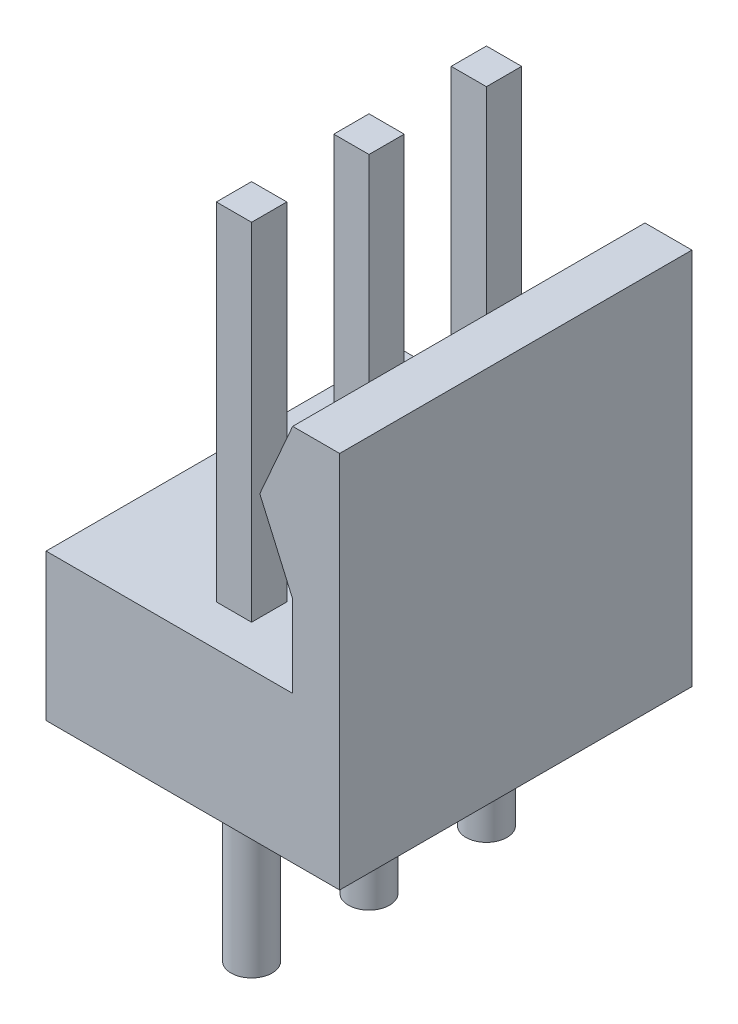
ISO-10303-21;
HEADER;
FILE_DESCRIPTION(('STEP AP214'),'2;1');
FILE_NAME('part.step','',(''),(''),'','','');
FILE_SCHEMA(('AUTOMOTIVE_DESIGN { 1 0 10303 214 1 1 1 1 }'));
ENDSEC;
DATA;
#1=APPLICATION_CONTEXT('core data for automotive mechanical design processes');
#2=APPLICATION_PROTOCOL_DEFINITION('international standard','automotive_design',2000,#1);
#3=PRODUCT_CONTEXT('',#1,'mechanical');
#4=PRODUCT('Part','Part','',(#3));
#5=PRODUCT_RELATED_PRODUCT_CATEGORY('part','',(#4));
#6=PRODUCT_DEFINITION_FORMATION('','',#4);
#7=PRODUCT_DEFINITION_CONTEXT('part definition',#1,'design');
#8=PRODUCT_DEFINITION('design','',#6,#7);
#9=PRODUCT_DEFINITION_SHAPE('','',#8);
#10=(LENGTH_UNIT() NAMED_UNIT(*) SI_UNIT(.MILLI.,.METRE.));
#11=(NAMED_UNIT(*) PLANE_ANGLE_UNIT() SI_UNIT($,.RADIAN.));
#12=(NAMED_UNIT(*) SI_UNIT($,.STERADIAN.) SOLID_ANGLE_UNIT());
#13=UNCERTAINTY_MEASURE_WITH_UNIT(LENGTH_MEASURE(1.E-05),#10,'distance_accuracy_value','');
#14=(GEOMETRIC_REPRESENTATION_CONTEXT(3) GLOBAL_UNCERTAINTY_ASSIGNED_CONTEXT((#13)) GLOBAL_UNIT_ASSIGNED_CONTEXT((#10,
#11,#12)) REPRESENTATION_CONTEXT('',''));
#15=CARTESIAN_POINT('',(0.,0.,0.));
#16=DIRECTION('',(0.,0.,1.));
#17=DIRECTION('',(1.,0.,0.));
#18=AXIS2_PLACEMENT_3D('',#15,#16,#17);
#19=CARTESIAN_POINT('',(-0.381,0.,2.159));
#20=DIRECTION('',(0.,0.,-1.));
#21=DIRECTION('',(-1.,0.,0.));
#22=AXIS2_PLACEMENT_3D('',#19,#20,#21);
#23=PLANE('',#22);
#24=DIRECTION('',(1.,0.,0.));
#25=VECTOR('',#24,1.);
#26=CARTESIAN_POINT('',(0.,10.668,2.159));
#27=LINE('',#26,#25);
#28=CARTESIAN_POINT('',(0.381,10.668,2.159));
#29=VERTEX_POINT('',#28);
#30=CARTESIAN_POINT('',(-0.381,10.668,2.159));
#31=VERTEX_POINT('',#30);
#32=EDGE_CURVE('E167',#29,#31,#27,.F.);
#33=ORIENTED_EDGE('',*,*,#32,.F.);
#34=DIRECTION('',(0.,1.,0.));
#35=VECTOR('',#34,1.);
#36=CARTESIAN_POINT('',(0.381,0.,2.159));
#37=LINE('',#36,#35);
#38=CARTESIAN_POINT('',(0.381,3.175,2.159));
#39=VERTEX_POINT('',#38);
#40=EDGE_CURVE('E150',#39,#29,#37,.T.);
#41=ORIENTED_EDGE('',*,*,#40,.F.);
#42=DIRECTION('',(-1.,0.,0.));
#43=VECTOR('',#42,1.);
#44=CARTESIAN_POINT('',(-0.381,3.175,2.159));
#45=LINE('',#44,#43);
#46=CARTESIAN_POINT('',(-0.381,3.175,2.159));
#47=VERTEX_POINT('',#46);
#48=EDGE_CURVE('E155',#39,#47,#45,.T.);
#49=ORIENTED_EDGE('',*,*,#48,.T.);
#50=DIRECTION('',(0.,1.,0.));
#51=VECTOR('',#50,1.);
#52=CARTESIAN_POINT('',(-0.381,0.,2.159));
#53=LINE('',#52,#51);
#54=EDGE_CURVE('E272',#31,#47,#53,.F.);
#55=ORIENTED_EDGE('',*,*,#54,.F.);
#56=EDGE_LOOP('',(#33,#41,#49,#55));
#57=FACE_BOUND('',#56,.T.);
#58=ADVANCED_FACE('F16',(#57),#23,.T.);
#59=CARTESIAN_POINT('',(-0.381,0.,4.699));
#60=DIRECTION('',(0.,0.,-1.));
#61=DIRECTION('',(-1.,0.,0.));
#62=AXIS2_PLACEMENT_3D('',#59,#60,#61);
#63=PLANE('',#62);
#64=DIRECTION('',(1.,0.,0.));
#65=VECTOR('',#64,1.);
#66=CARTESIAN_POINT('',(0.,10.668,4.699));
#67=LINE('',#66,#65);
#68=CARTESIAN_POINT('',(0.381,10.668,4.699));
#69=VERTEX_POINT('',#68);
#70=CARTESIAN_POINT('',(-0.381,10.668,4.699));
#71=VERTEX_POINT('',#70);
#72=EDGE_CURVE('E262',#69,#71,#67,.F.);
#73=ORIENTED_EDGE('',*,*,#72,.F.);
#74=DIRECTION('',(0.,1.,0.));
#75=VECTOR('',#74,1.);
#76=CARTESIAN_POINT('',(0.381,0.,4.699));
#77=LINE('',#76,#75);
#78=CARTESIAN_POINT('',(0.381,3.175,4.699));
#79=VERTEX_POINT('',#78);
#80=EDGE_CURVE('E267',#79,#69,#77,.T.);
#81=ORIENTED_EDGE('',*,*,#80,.F.);
#82=DIRECTION('',(-1.,0.,0.));
#83=VECTOR('',#82,1.);
#84=CARTESIAN_POINT('',(-0.381,3.175,4.699));
#85=LINE('',#84,#83);
#86=CARTESIAN_POINT('',(-0.381,3.175,4.699));
#87=VERTEX_POINT('',#86);
#88=EDGE_CURVE('E165',#79,#87,#85,.T.);
#89=ORIENTED_EDGE('',*,*,#88,.T.);
#90=DIRECTION('',(0.,1.,0.));
#91=VECTOR('',#90,1.);
#92=CARTESIAN_POINT('',(-0.381,0.,4.699));
#93=LINE('',#92,#91);
#94=EDGE_CURVE('E254',#71,#87,#93,.F.);
#95=ORIENTED_EDGE('',*,*,#94,.F.);
#96=EDGE_LOOP('',(#73,#81,#89,#95));
#97=FACE_BOUND('',#96,.T.);
#98=ADVANCED_FACE('F343',(#97),#63,.T.);
#99=CARTESIAN_POINT('',(-0.381,0.,-0.381));
#100=DIRECTION('',(0.,0.,-1.));
#101=DIRECTION('',(-1.,0.,0.));
#102=AXIS2_PLACEMENT_3D('',#99,#100,#101);
#103=PLANE('',#102);
#104=DIRECTION('',(1.,0.,0.));
#105=VECTOR('',#104,1.);
#106=CARTESIAN_POINT('',(0.,10.668,-0.381));
#107=LINE('',#106,#105);
#108=CARTESIAN_POINT('',(0.381,10.668,-0.381));
#109=VERTEX_POINT('',#108);
#110=CARTESIAN_POINT('',(-0.381,10.668,-0.381));
#111=VERTEX_POINT('',#110);
#112=EDGE_CURVE('E244',#109,#111,#107,.F.);
#113=ORIENTED_EDGE('',*,*,#112,.F.);
#114=DIRECTION('',(0.,1.,0.));
#115=VECTOR('',#114,1.);
#116=CARTESIAN_POINT('',(0.381,0.,-0.381));
#117=LINE('',#116,#115);
#118=CARTESIAN_POINT('',(0.381,3.175,-0.381));
#119=VERTEX_POINT('',#118);
#120=EDGE_CURVE('E249',#119,#109,#117,.T.);
#121=ORIENTED_EDGE('',*,*,#120,.F.);
#122=DIRECTION('',(-1.,0.,0.));
#123=VECTOR('',#122,1.);
#124=CARTESIAN_POINT('',(-0.381,3.175,-0.381));
#125=LINE('',#124,#123);
#126=CARTESIAN_POINT('',(-0.381,3.175,-0.381));
#127=VERTEX_POINT('',#126);
#128=EDGE_CURVE('E175',#119,#127,#125,.T.);
#129=ORIENTED_EDGE('',*,*,#128,.T.);
#130=DIRECTION('',(0.,1.,0.));
#131=VECTOR('',#130,1.);
#132=CARTESIAN_POINT('',(-0.381,0.,-0.381));
#133=LINE('',#132,#131);
#134=EDGE_CURVE('E236',#111,#127,#133,.F.);
#135=ORIENTED_EDGE('',*,*,#134,.F.);
#136=EDGE_LOOP('',(#113,#121,#129,#135));
#137=FACE_BOUND('',#136,.T.);
#138=ADVANCED_FACE('F341',(#137),#103,.T.);
#139=CARTESIAN_POINT('',(0.381,0.,2.159));
#140=DIRECTION('',(1.,0.,0.));
#141=DIRECTION('',(0.,0.,-1.));
#142=AXIS2_PLACEMENT_3D('',#139,#140,#141);
#143=PLANE('',#142);
#144=DIRECTION('',(0.,0.,1.));
#145=VECTOR('',#144,1.);
#146=CARTESIAN_POINT('',(0.381,10.668,2.54));
#147=LINE('',#146,#145);
#148=CARTESIAN_POINT('',(0.381,10.668,2.921));
#149=VERTEX_POINT('',#148);
#150=EDGE_CURVE('E169',#149,#29,#147,.F.);
#151=ORIENTED_EDGE('',*,*,#150,.F.);
#152=DIRECTION('',(0.,1.,0.));
#153=VECTOR('',#152,1.);
#154=CARTESIAN_POINT('',(0.381,0.,2.921));
#155=LINE('',#154,#153);
#156=CARTESIAN_POINT('',(0.381,3.175,2.921));
#157=VERTEX_POINT('',#156);
#158=EDGE_CURVE('E173',#157,#149,#155,.T.);
#159=ORIENTED_EDGE('',*,*,#158,.F.);
#160=DIRECTION('',(0.,0.,-1.));
#161=VECTOR('',#160,1.);
#162=CARTESIAN_POINT('',(0.381,3.175,2.159));
#163=LINE('',#162,#161);
#164=EDGE_CURVE('E159',#157,#39,#163,.T.);
#165=ORIENTED_EDGE('',*,*,#164,.T.);
#166=ORIENTED_EDGE('',*,*,#40,.T.);
#167=EDGE_LOOP('',(#151,#159,#165,#166));
#168=FACE_BOUND('',#167,.T.);
#169=ADVANCED_FACE('F171',(#168),#143,.T.);
#170=CARTESIAN_POINT('',(0.,10.668,2.54));
#171=DIRECTION('',(0.,1.,0.));
#172=DIRECTION('',(0.,0.,1.));
#173=AXIS2_PLACEMENT_3D('',#170,#171,#172);
#174=PLANE('',#173);
#175=ORIENTED_EDGE('',*,*,#150,.T.);
#176=ORIENTED_EDGE('',*,*,#32,.T.);
#177=DIRECTION('',(0.,0.,1.));
#178=VECTOR('',#177,1.);
#179=CARTESIAN_POINT('',(-0.381,10.668,2.921));
#180=LINE('',#179,#178);
#181=CARTESIAN_POINT('',(-0.381,10.668,2.921));
#182=VERTEX_POINT('',#181);
#183=EDGE_CURVE('E274',#182,#31,#180,.F.);
#184=ORIENTED_EDGE('',*,*,#183,.F.);
#185=DIRECTION('',(1.,0.,0.));
#186=VECTOR('',#185,1.);
#187=CARTESIAN_POINT('',(0.381,10.668,2.921));
#188=LINE('',#187,#186);
#189=EDGE_CURVE('E232',#149,#182,#188,.F.);
#190=ORIENTED_EDGE('',*,*,#189,.F.);
#191=EDGE_LOOP('',(#175,#176,#184,#190));
#192=FACE_BOUND('',#191,.T.);
#193=ADVANCED_FACE('F280',(#192),#174,.T.);
#194=CARTESIAN_POINT('',(-0.381,0.,2.921));
#195=DIRECTION('',(-1.,0.,0.));
#196=DIRECTION('',(0.,0.,1.));
#197=AXIS2_PLACEMENT_3D('',#194,#195,#196);
#198=PLANE('',#197);
#199=ORIENTED_EDGE('',*,*,#183,.T.);
#200=ORIENTED_EDGE('',*,*,#54,.T.);
#201=DIRECTION('',(0.,0.,1.));
#202=VECTOR('',#201,1.);
#203=CARTESIAN_POINT('',(-0.381,3.175,2.921));
#204=LINE('',#203,#202);
#205=CARTESIAN_POINT('',(-0.381,3.175,2.921));
#206=VERTEX_POINT('',#205);
#207=EDGE_CURVE('E161',#47,#206,#204,.T.);
#208=ORIENTED_EDGE('',*,*,#207,.T.);
#209=DIRECTION('',(0.,1.,0.));
#210=VECTOR('',#209,1.);
#211=CARTESIAN_POINT('',(-0.381,0.,2.921));
#212=LINE('',#211,#210);
#213=EDGE_CURVE('E229',#182,#206,#212,.F.);
#214=ORIENTED_EDGE('',*,*,#213,.F.);
#215=EDGE_LOOP('',(#199,#200,#208,#214));
#216=FACE_BOUND('',#215,.T.);
#217=ADVANCED_FACE('F436',(#216),#198,.T.);
#218=CARTESIAN_POINT('',(0.381,0.,4.699));
#219=DIRECTION('',(1.,0.,0.));
#220=DIRECTION('',(0.,0.,-1.));
#221=AXIS2_PLACEMENT_3D('',#218,#219,#220);
#222=PLANE('',#221);
#223=DIRECTION('',(0.,0.,1.));
#224=VECTOR('',#223,1.);
#225=CARTESIAN_POINT('',(0.381,10.668,5.08));
#226=LINE('',#225,#224);
#227=CARTESIAN_POINT('',(0.381,10.668,5.461));
#228=VERTEX_POINT('',#227);
#229=EDGE_CURVE('E264',#228,#69,#226,.F.);
#230=ORIENTED_EDGE('',*,*,#229,.F.);
#231=DIRECTION('',(0.,1.,0.));
#232=VECTOR('',#231,1.);
#233=CARTESIAN_POINT('',(0.381,0.,5.461));
#234=LINE('',#233,#232);
#235=CARTESIAN_POINT('',(0.381,3.175,5.461));
#236=VERTEX_POINT('',#235);
#237=EDGE_CURVE('E226',#236,#228,#234,.T.);
#238=ORIENTED_EDGE('',*,*,#237,.F.);
#239=DIRECTION('',(0.,0.,-1.));
#240=VECTOR('',#239,1.);
#241=CARTESIAN_POINT('',(0.381,3.175,4.699));
#242=LINE('',#241,#240);
#243=EDGE_CURVE('E269',#236,#79,#242,.T.);
#244=ORIENTED_EDGE('',*,*,#243,.T.);
#245=ORIENTED_EDGE('',*,*,#80,.T.);
#246=EDGE_LOOP('',(#230,#238,#244,#245));
#247=FACE_BOUND('',#246,.T.);
#248=ADVANCED_FACE('F432',(#247),#222,.T.);
#249=CARTESIAN_POINT('',(0.,10.668,5.08));
#250=DIRECTION('',(0.,1.,0.));
#251=DIRECTION('',(0.,0.,1.));
#252=AXIS2_PLACEMENT_3D('',#249,#250,#251);
#253=PLANE('',#252);
#254=ORIENTED_EDGE('',*,*,#229,.T.);
#255=ORIENTED_EDGE('',*,*,#72,.T.);
#256=DIRECTION('',(0.,0.,1.));
#257=VECTOR('',#256,1.);
#258=CARTESIAN_POINT('',(-0.381,10.668,5.461));
#259=LINE('',#258,#257);
#260=CARTESIAN_POINT('',(-0.381,10.668,5.461));
#261=VERTEX_POINT('',#260);
#262=EDGE_CURVE('E257',#261,#71,#259,.F.);
#263=ORIENTED_EDGE('',*,*,#262,.F.);
#264=DIRECTION('',(1.,0.,0.));
#265=VECTOR('',#264,1.);
#266=CARTESIAN_POINT('',(0.381,10.668,5.461));
#267=LINE('',#266,#265);
#268=EDGE_CURVE('E223',#228,#261,#267,.F.);
#269=ORIENTED_EDGE('',*,*,#268,.F.);
#270=EDGE_LOOP('',(#254,#255,#263,#269));
#271=FACE_BOUND('',#270,.T.);
#272=ADVANCED_FACE('F428',(#271),#253,.T.);
#273=CARTESIAN_POINT('',(-0.381,0.,5.461));
#274=DIRECTION('',(-1.,0.,0.));
#275=DIRECTION('',(0.,0.,1.));
#276=AXIS2_PLACEMENT_3D('',#273,#274,#275);
#277=PLANE('',#276);
#278=ORIENTED_EDGE('',*,*,#262,.T.);
#279=ORIENTED_EDGE('',*,*,#94,.T.);
#280=DIRECTION('',(0.,0.,1.));
#281=VECTOR('',#280,1.);
#282=CARTESIAN_POINT('',(-0.381,3.175,5.461));
#283=LINE('',#282,#281);
#284=CARTESIAN_POINT('',(-0.381,3.175,5.461));
#285=VERTEX_POINT('',#284);
#286=EDGE_CURVE('E260',#87,#285,#283,.T.);
#287=ORIENTED_EDGE('',*,*,#286,.T.);
#288=DIRECTION('',(0.,1.,0.));
#289=VECTOR('',#288,1.);
#290=CARTESIAN_POINT('',(-0.381,0.,5.461));
#291=LINE('',#290,#289);
#292=EDGE_CURVE('E220',#261,#285,#291,.F.);
#293=ORIENTED_EDGE('',*,*,#292,.F.);
#294=EDGE_LOOP('',(#278,#279,#287,#293));
#295=FACE_BOUND('',#294,.T.);
#296=ADVANCED_FACE('F425',(#295),#277,.T.);
#297=CARTESIAN_POINT('',(0.381,0.,-0.381));
#298=DIRECTION('',(1.,0.,0.));
#299=DIRECTION('',(0.,0.,-1.));
#300=AXIS2_PLACEMENT_3D('',#297,#298,#299);
#301=PLANE('',#300);
#302=DIRECTION('',(0.,0.,1.));
#303=VECTOR('',#302,1.);
#304=CARTESIAN_POINT('',(0.381,10.668,0.));
#305=LINE('',#304,#303);
#306=CARTESIAN_POINT('',(0.381,10.668,0.381));
#307=VERTEX_POINT('',#306);
#308=EDGE_CURVE('E246',#307,#109,#305,.F.);
#309=ORIENTED_EDGE('',*,*,#308,.F.);
#310=DIRECTION('',(0.,1.,0.));
#311=VECTOR('',#310,1.);
#312=CARTESIAN_POINT('',(0.381,0.,0.381));
#313=LINE('',#312,#311);
#314=CARTESIAN_POINT('',(0.381,3.175,0.381));
#315=VERTEX_POINT('',#314);
#316=EDGE_CURVE('E213',#315,#307,#313,.T.);
#317=ORIENTED_EDGE('',*,*,#316,.F.);
#318=DIRECTION('',(0.,0.,-1.));
#319=VECTOR('',#318,1.);
#320=CARTESIAN_POINT('',(0.381,3.175,-0.381));
#321=LINE('',#320,#319);
#322=EDGE_CURVE('E251',#315,#119,#321,.T.);
#323=ORIENTED_EDGE('',*,*,#322,.T.);
#324=ORIENTED_EDGE('',*,*,#120,.T.);
#325=EDGE_LOOP('',(#309,#317,#323,#324));
#326=FACE_BOUND('',#325,.T.);
#327=ADVANCED_FACE('F332',(#326),#301,.T.);
#328=CARTESIAN_POINT('',(0.,10.668,0.));
#329=DIRECTION('',(0.,1.,0.));
#330=DIRECTION('',(0.,0.,1.));
#331=AXIS2_PLACEMENT_3D('',#328,#329,#330);
#332=PLANE('',#331);
#333=ORIENTED_EDGE('',*,*,#308,.T.);
#334=ORIENTED_EDGE('',*,*,#112,.T.);
#335=DIRECTION('',(0.,0.,1.));
#336=VECTOR('',#335,1.);
#337=CARTESIAN_POINT('',(-0.381,10.668,0.381));
#338=LINE('',#337,#336);
#339=CARTESIAN_POINT('',(-0.381,10.668,0.381));
#340=VERTEX_POINT('',#339);
#341=EDGE_CURVE('E239',#340,#111,#338,.F.);
#342=ORIENTED_EDGE('',*,*,#341,.F.);
#343=DIRECTION('',(1.,0.,0.));
#344=VECTOR('',#343,1.);
#345=CARTESIAN_POINT('',(0.381,10.668,0.381));
#346=LINE('',#345,#344);
#347=EDGE_CURVE('E206',#307,#340,#346,.F.);
#348=ORIENTED_EDGE('',*,*,#347,.F.);
#349=EDGE_LOOP('',(#333,#334,#342,#348));
#350=FACE_BOUND('',#349,.T.);
#351=ADVANCED_FACE('F336',(#350),#332,.T.);
#352=CARTESIAN_POINT('',(-0.381,0.,0.381));
#353=DIRECTION('',(-1.,0.,0.));
#354=DIRECTION('',(0.,0.,1.));
#355=AXIS2_PLACEMENT_3D('',#352,#353,#354);
#356=PLANE('',#355);
#357=ORIENTED_EDGE('',*,*,#341,.T.);
#358=ORIENTED_EDGE('',*,*,#134,.T.);
#359=DIRECTION('',(0.,0.,1.));
#360=VECTOR('',#359,1.);
#361=CARTESIAN_POINT('',(-0.381,3.175,0.381));
#362=LINE('',#361,#360);
#363=CARTESIAN_POINT('',(-0.381,3.175,0.381));
#364=VERTEX_POINT('',#363);
#365=EDGE_CURVE('E242',#127,#364,#362,.T.);
#366=ORIENTED_EDGE('',*,*,#365,.T.);
#367=DIRECTION('',(0.,1.,0.));
#368=VECTOR('',#367,1.);
#369=CARTESIAN_POINT('',(-0.381,0.,0.381));
#370=LINE('',#369,#368);
#371=EDGE_CURVE('E202',#340,#364,#370,.F.);
#372=ORIENTED_EDGE('',*,*,#371,.F.);
#373=EDGE_LOOP('',(#357,#358,#366,#372));
#374=FACE_BOUND('',#373,.T.);
#375=ADVANCED_FACE('F339',(#374),#356,.T.);
#376=CARTESIAN_POINT('',(0.,-3.556,2.54));
#377=DIRECTION('',(0.,1.,0.));
#378=DIRECTION('',(0.,0.,1.));
#379=AXIS2_PLACEMENT_3D('',#376,#377,#378);
#380=PLANE('',#379);
#381=CARTESIAN_POINT('',(0.,-3.556,2.54));
#382=DIRECTION('',(0.,-1.,0.));
#383=DIRECTION('',(0.,0.,-1.));
#384=AXIS2_PLACEMENT_3D('',#381,#382,#383);
#385=CIRCLE('',#384,0.4445);
#386=CARTESIAN_POINT('',(0.,-3.556,2.0955));
#387=VERTEX_POINT('',#386);
#388=EDGE_CURVE('E19',#387,#387,#385,.F.);
#389=ORIENTED_EDGE('',*,*,#388,.F.);
#390=EDGE_LOOP('',(#389));
#391=FACE_BOUND('',#390,.T.);
#392=ADVANCED_FACE('F414',(#391),#380,.F.);
#393=CARTESIAN_POINT('',(0.,-3.556,5.08));
#394=DIRECTION('',(0.,1.,0.));
#395=DIRECTION('',(0.,0.,1.));
#396=AXIS2_PLACEMENT_3D('',#393,#394,#395);
#397=PLANE('',#396);
#398=CARTESIAN_POINT('',(0.,-3.556,5.08));
#399=DIRECTION('',(0.,-1.,0.));
#400=DIRECTION('',(0.,0.,-1.));
#401=AXIS2_PLACEMENT_3D('',#398,#399,#400);
#402=CIRCLE('',#401,0.4445);
#403=CARTESIAN_POINT('',(0.,-3.556,4.6355));
#404=VERTEX_POINT('',#403);
#405=EDGE_CURVE('E197',#404,#404,#402,.F.);
#406=ORIENTED_EDGE('',*,*,#405,.F.);
#407=EDGE_LOOP('',(#406));
#408=FACE_BOUND('',#407,.T.);
#409=ADVANCED_FACE('F410',(#408),#397,.F.);
#410=CARTESIAN_POINT('',(0.,-3.556,0.));
#411=DIRECTION('',(0.,1.,0.));
#412=DIRECTION('',(0.,0.,1.));
#413=AXIS2_PLACEMENT_3D('',#410,#411,#412);
#414=PLANE('',#413);
#415=CARTESIAN_POINT('',(0.,-3.556,0.));
#416=DIRECTION('',(0.,-1.,0.));
#417=DIRECTION('',(0.,0.,-1.));
#418=AXIS2_PLACEMENT_3D('',#415,#416,#417);
#419=CIRCLE('',#418,0.4445);
#420=CARTESIAN_POINT('',(0.,-3.556,-0.4445));
#421=VERTEX_POINT('',#420);
#422=EDGE_CURVE('E194',#421,#421,#419,.F.);
#423=ORIENTED_EDGE('',*,*,#422,.F.);
#424=EDGE_LOOP('',(#423));
#425=FACE_BOUND('',#424,.T.);
#426=ADVANCED_FACE('F407',(#425),#414,.F.);
#427=CARTESIAN_POINT('',(0.381,0.,2.921));
#428=DIRECTION('',(0.,0.,1.));
#429=DIRECTION('',(1.,0.,0.));
#430=AXIS2_PLACEMENT_3D('',#427,#428,#429);
#431=PLANE('',#430);
#432=ORIENTED_EDGE('',*,*,#189,.T.);
#433=ORIENTED_EDGE('',*,*,#213,.T.);
#434=DIRECTION('',(1.,0.,0.));
#435=VECTOR('',#434,1.);
#436=CARTESIAN_POINT('',(-3.175,3.175,2.921));
#437=LINE('',#436,#435);
#438=EDGE_CURVE('E284',#157,#206,#437,.F.);
#439=ORIENTED_EDGE('',*,*,#438,.F.);
#440=ORIENTED_EDGE('',*,*,#158,.T.);
#441=EDGE_LOOP('',(#432,#433,#439,#440));
#442=FACE_BOUND('',#441,.T.);
#443=ADVANCED_FACE('F283',(#442),#431,.T.);
#444=CARTESIAN_POINT('',(0.381,0.,5.461));
#445=DIRECTION('',(0.,0.,1.));
#446=DIRECTION('',(1.,0.,0.));
#447=AXIS2_PLACEMENT_3D('',#444,#445,#446);
#448=PLANE('',#447);
#449=ORIENTED_EDGE('',*,*,#268,.T.);
#450=ORIENTED_EDGE('',*,*,#292,.T.);
#451=DIRECTION('',(1.,0.,0.));
#452=VECTOR('',#451,1.);
#453=CARTESIAN_POINT('',(-3.175,3.175,5.461));
#454=LINE('',#453,#452);
#455=EDGE_CURVE('E285',#236,#285,#454,.F.);
#456=ORIENTED_EDGE('',*,*,#455,.F.);
#457=ORIENTED_EDGE('',*,*,#237,.T.);
#458=EDGE_LOOP('',(#449,#450,#456,#457));
#459=FACE_BOUND('',#458,.T.);
#460=ADVANCED_FACE('F401',(#459),#448,.T.);
#461=CARTESIAN_POINT('',(0.381,0.,0.381));
#462=DIRECTION('',(0.,0.,1.));
#463=DIRECTION('',(1.,0.,0.));
#464=AXIS2_PLACEMENT_3D('',#461,#462,#463);
#465=PLANE('',#464);
#466=ORIENTED_EDGE('',*,*,#347,.T.);
#467=ORIENTED_EDGE('',*,*,#371,.T.);
#468=DIRECTION('',(1.,0.,0.));
#469=VECTOR('',#468,1.);
#470=CARTESIAN_POINT('',(-3.175,3.175,0.381));
#471=LINE('',#470,#469);
#472=EDGE_CURVE('E289',#315,#364,#471,.F.);
#473=ORIENTED_EDGE('',*,*,#472,.F.);
#474=ORIENTED_EDGE('',*,*,#316,.T.);
#475=EDGE_LOOP('',(#466,#467,#473,#474));
#476=FACE_BOUND('',#475,.T.);
#477=ADVANCED_FACE('F329',(#476),#465,.T.);
#478=CARTESIAN_POINT('',(0.,0.,2.54));
#479=DIRECTION('',(0.,-1.,0.));
#480=DIRECTION('',(0.,0.,-1.));
#481=AXIS2_PLACEMENT_3D('',#478,#479,#480);
#482=CYLINDRICAL_SURFACE('',#481,0.4445);
#483=CARTESIAN_POINT('',(0.,0.,2.54));
#484=DIRECTION('',(0.,-1.,0.));
#485=DIRECTION('',(0.,0.,-1.));
#486=AXIS2_PLACEMENT_3D('',#483,#484,#485);
#487=CIRCLE('',#486,0.4445);
#488=CARTESIAN_POINT('',(0.,0.,2.0955));
#489=VERTEX_POINT('',#488);
#490=EDGE_CURVE('E190',#489,#489,#487,.F.);
#491=ORIENTED_EDGE('',*,*,#490,.F.);
#492=EDGE_LOOP('',(#491));
#493=FACE_BOUND('',#492,.T.);
#494=ORIENTED_EDGE('',*,*,#388,.T.);
#495=EDGE_LOOP('',(#494));
#496=FACE_BOUND('',#495,.T.);
#497=ADVANCED_FACE('F394',(#493,#496),#482,.T.);
#498=CARTESIAN_POINT('',(0.,0.,5.08));
#499=DIRECTION('',(0.,-1.,0.));
#500=DIRECTION('',(0.,0.,-1.));
#501=AXIS2_PLACEMENT_3D('',#498,#499,#500);
#502=CYLINDRICAL_SURFACE('',#501,0.4445);
#503=CARTESIAN_POINT('',(0.,0.,5.08));
#504=DIRECTION('',(0.,-1.,0.));
#505=DIRECTION('',(0.,0.,-1.));
#506=AXIS2_PLACEMENT_3D('',#503,#504,#505);
#507=CIRCLE('',#506,0.4445);
#508=CARTESIAN_POINT('',(0.,0.,4.6355));
#509=VERTEX_POINT('',#508);
#510=EDGE_CURVE('E187',#509,#509,#507,.F.);
#511=ORIENTED_EDGE('',*,*,#510,.F.);
#512=EDGE_LOOP('',(#511));
#513=FACE_BOUND('',#512,.T.);
#514=ORIENTED_EDGE('',*,*,#405,.T.);
#515=EDGE_LOOP('',(#514));
#516=FACE_BOUND('',#515,.T.);
#517=ADVANCED_FACE('F390',(#513,#516),#502,.T.);
#518=CARTESIAN_POINT('',(0.,0.,0.));
#519=DIRECTION('',(0.,-1.,0.));
#520=DIRECTION('',(0.,0.,-1.));
#521=AXIS2_PLACEMENT_3D('',#518,#519,#520);
#522=CYLINDRICAL_SURFACE('',#521,0.4445);
#523=CARTESIAN_POINT('',(0.,0.,0.));
#524=DIRECTION('',(0.,-1.,0.));
#525=DIRECTION('',(0.,0.,-1.));
#526=AXIS2_PLACEMENT_3D('',#523,#524,#525);
#527=CIRCLE('',#526,0.4445);
#528=CARTESIAN_POINT('',(0.,0.,-0.4445));
#529=VERTEX_POINT('',#528);
#530=EDGE_CURVE('E183',#529,#529,#527,.F.);
#531=ORIENTED_EDGE('',*,*,#530,.F.);
#532=EDGE_LOOP('',(#531));
#533=FACE_BOUND('',#532,.T.);
#534=ORIENTED_EDGE('',*,*,#422,.T.);
#535=EDGE_LOOP('',(#534));
#536=FACE_BOUND('',#535,.T.);
#537=ADVANCED_FACE('F386',(#533,#536),#522,.T.);
#538=CARTESIAN_POINT('',(-3.175,0.,0.));
#539=DIRECTION('',(-1.,0.,0.));
#540=DIRECTION('',(0.,0.,1.));
#541=AXIS2_PLACEMENT_3D('',#538,#539,#540);
#542=PLANE('',#541);
#543=DIRECTION('',(0.,0.,-1.));
#544=VECTOR('',#543,1.);
#545=CARTESIAN_POINT('',(-3.175,0.,0.));
#546=LINE('',#545,#544);
#547=CARTESIAN_POINT('',(-3.175,0.,6.35));
#548=VERTEX_POINT('',#547);
#549=CARTESIAN_POINT('',(-3.175,0.,-1.27));
#550=VERTEX_POINT('',#549);
#551=EDGE_CURVE('E193',#548,#550,#546,.T.);
#552=ORIENTED_EDGE('',*,*,#551,.F.);
#553=DIRECTION('',(0.,1.,0.));
#554=VECTOR('',#553,1.);
#555=CARTESIAN_POINT('',(-3.175,3.20537195816544,6.35));
#556=LINE('',#555,#554);
#557=CARTESIAN_POINT('',(-3.175,3.175,6.35));
#558=VERTEX_POINT('',#557);
#559=EDGE_CURVE('E704',#558,#548,#556,.F.);
#560=ORIENTED_EDGE('',*,*,#559,.F.);
#561=DIRECTION('',(0.,0.,1.));
#562=VECTOR('',#561,1.);
#563=CARTESIAN_POINT('',(-3.175,3.175,0.));
#564=LINE('',#563,#562);
#565=CARTESIAN_POINT('',(-3.175,3.175,-1.27));
#566=VERTEX_POINT('',#565);
#567=EDGE_CURVE('E286',#566,#558,#564,.T.);
#568=ORIENTED_EDGE('',*,*,#567,.F.);
#569=DIRECTION('',(0.,1.,0.));
#570=VECTOR('',#569,1.);
#571=CARTESIAN_POINT('',(-3.175,3.20537195816544,-1.27));
#572=LINE('',#571,#570);
#573=EDGE_CURVE('E723',#566,#550,#572,.F.);
#574=ORIENTED_EDGE('',*,*,#573,.T.);
#575=EDGE_LOOP('',(#552,#560,#568,#574));
#576=FACE_BOUND('',#575,.T.);
#577=ADVANCED_FACE('F383',(#576),#542,.T.);
#578=CARTESIAN_POINT('',(1.4478,6.56066538978969,0.));
#579=DIRECTION('',(-0.915477472248253,0.402369230689859,0.));
#580=DIRECTION('',(-0.402369230689859,-0.915477472248253,0.));
#581=AXIS2_PLACEMENT_3D('',#578,#579,#580);
#582=PLANE('',#581);
#583=DIRECTION('',(0.,0.,1.));
#584=VECTOR('',#583,1.);
#585=CARTESIAN_POINT('',(1.4478,6.56066538978969,0.));
#586=LINE('',#585,#584);
#587=CARTESIAN_POINT('',(1.4478,6.56066538978969,6.35));
#588=VERTEX_POINT('',#587);
#589=CARTESIAN_POINT('',(1.4478,6.56066538978969,-1.27));
#590=VERTEX_POINT('',#589);
#591=EDGE_CURVE('E196',#588,#590,#586,.F.);
#592=ORIENTED_EDGE('',*,*,#591,.F.);
#593=DIRECTION('',(-0.402369230689859,-0.915477472248253,0.));
#594=VECTOR('',#593,1.);
#595=CARTESIAN_POINT('',(2.159,8.1788,6.35));
#596=LINE('',#595,#594);
#597=CARTESIAN_POINT('',(2.159,8.1788,6.35));
#598=VERTEX_POINT('',#597);
#599=EDGE_CURVE('E714',#598,#588,#596,.T.);
#600=ORIENTED_EDGE('',*,*,#599,.F.);
#601=DIRECTION('',(0.,0.,1.));
#602=VECTOR('',#601,1.);
#603=CARTESIAN_POINT('',(2.159,8.1788,0.));
#604=LINE('',#603,#602);
#605=CARTESIAN_POINT('',(2.159,8.1788,-1.27));
#606=VERTEX_POINT('',#605);
#607=EDGE_CURVE('E718',#606,#598,#604,.T.);
#608=ORIENTED_EDGE('',*,*,#607,.F.);
#609=DIRECTION('',(-0.402369230689859,-0.915477472248253,0.));
#610=VECTOR('',#609,1.);
#611=CARTESIAN_POINT('',(2.159,8.1788,-1.27));
#612=LINE('',#611,#610);
#613=EDGE_CURVE('E186',#606,#590,#612,.T.);
#614=ORIENTED_EDGE('',*,*,#613,.T.);
#615=EDGE_LOOP('',(#592,#600,#608,#614));
#616=FACE_BOUND('',#615,.T.);
#617=ADVANCED_FACE('F380',(#616),#582,.T.);
#618=CARTESIAN_POINT('',(2.159,4.94253077957938,0.));
#619=DIRECTION('',(-0.915477472248253,-0.402369230689858,0.));
#620=DIRECTION('',(0.402369230689858,-0.915477472248253,0.));
#621=AXIS2_PLACEMENT_3D('',#618,#619,#620);
#622=PLANE('',#621);
#623=DIRECTION('',(0.,0.,1.));
#624=VECTOR('',#623,1.);
#625=CARTESIAN_POINT('',(2.159,4.94253077957938,0.));
#626=LINE('',#625,#624);
#627=CARTESIAN_POINT('',(2.159,4.94253077957938,6.35));
#628=VERTEX_POINT('',#627);
#629=CARTESIAN_POINT('',(2.159,4.94253077957938,-1.27));
#630=VERTEX_POINT('',#629);
#631=EDGE_CURVE('E297',#628,#630,#626,.F.);
#632=ORIENTED_EDGE('',*,*,#631,.F.);
#633=DIRECTION('',(0.402369230689859,-0.915477472248253,0.));
#634=VECTOR('',#633,1.);
#635=CARTESIAN_POINT('',(1.4478,6.56066538978969,6.35));
#636=LINE('',#635,#634);
#637=EDGE_CURVE('E309',#588,#628,#636,.T.);
#638=ORIENTED_EDGE('',*,*,#637,.F.);
#639=ORIENTED_EDGE('',*,*,#591,.T.);
#640=DIRECTION('',(0.402369230689859,-0.915477472248253,0.));
#641=VECTOR('',#640,1.);
#642=CARTESIAN_POINT('',(1.4478,6.56066538978969,-1.27));
#643=LINE('',#642,#641);
#644=EDGE_CURVE('E307',#590,#630,#643,.T.);
#645=ORIENTED_EDGE('',*,*,#644,.T.);
#646=EDGE_LOOP('',(#632,#638,#639,#645));
#647=FACE_BOUND('',#646,.T.);
#648=ADVANCED_FACE('F306',(#647),#622,.T.);
#649=CARTESIAN_POINT('',(2.159,3.175,0.));
#650=DIRECTION('',(-1.,0.,0.));
#651=DIRECTION('',(0.,0.,1.));
#652=AXIS2_PLACEMENT_3D('',#649,#650,#651);
#653=PLANE('',#652);
#654=DIRECTION('',(0.,0.,1.));
#655=VECTOR('',#654,1.);
#656=CARTESIAN_POINT('',(2.159,3.175,0.));
#657=LINE('',#656,#655);
#658=CARTESIAN_POINT('',(2.159,3.175,6.35));
#659=VERTEX_POINT('',#658);
#660=CARTESIAN_POINT('',(2.159,3.175,-1.27));
#661=VERTEX_POINT('',#660);
#662=EDGE_CURVE('E292',#659,#661,#657,.F.);
#663=ORIENTED_EDGE('',*,*,#662,.F.);
#664=DIRECTION('',(0.,1.,0.));
#665=VECTOR('',#664,1.);
#666=CARTESIAN_POINT('',(2.159,3.20537195816544,6.35));
#667=LINE('',#666,#665);
#668=EDGE_CURVE('E711',#628,#659,#667,.F.);
#669=ORIENTED_EDGE('',*,*,#668,.F.);
#670=ORIENTED_EDGE('',*,*,#631,.T.);
#671=DIRECTION('',(0.,1.,0.));
#672=VECTOR('',#671,1.);
#673=CARTESIAN_POINT('',(2.159,3.20537195816544,-1.27));
#674=LINE('',#673,#672);
#675=EDGE_CURVE('E318',#630,#661,#674,.F.);
#676=ORIENTED_EDGE('',*,*,#675,.T.);
#677=EDGE_LOOP('',(#663,#669,#670,#676));
#678=FACE_BOUND('',#677,.T.);
#679=ADVANCED_FACE('F375',(#678),#653,.T.);
#680=CARTESIAN_POINT('',(-3.175,3.175,0.));
#681=DIRECTION('',(0.,1.,0.));
#682=DIRECTION('',(0.,0.,1.));
#683=AXIS2_PLACEMENT_3D('',#680,#681,#682);
#684=PLANE('',#683);
#685=ORIENTED_EDGE('',*,*,#322,.F.);
#686=ORIENTED_EDGE('',*,*,#472,.T.);
#687=ORIENTED_EDGE('',*,*,#365,.F.);
#688=ORIENTED_EDGE('',*,*,#128,.F.);
#689=EDGE_LOOP('',(#685,#686,#687,#688));
#690=FACE_BOUND('',#689,.T.);
#691=ORIENTED_EDGE('',*,*,#243,.F.);
#692=ORIENTED_EDGE('',*,*,#455,.T.);
#693=ORIENTED_EDGE('',*,*,#286,.F.);
#694=ORIENTED_EDGE('',*,*,#88,.F.);
#695=EDGE_LOOP('',(#691,#692,#693,#694));
#696=FACE_BOUND('',#695,.T.);
#697=ORIENTED_EDGE('',*,*,#164,.F.);
#698=ORIENTED_EDGE('',*,*,#438,.T.);
#699=ORIENTED_EDGE('',*,*,#207,.F.);
#700=ORIENTED_EDGE('',*,*,#48,.F.);
#701=EDGE_LOOP('',(#697,#698,#699,#700));
#702=FACE_BOUND('',#701,.T.);
#703=ORIENTED_EDGE('',*,*,#567,.T.);
#704=DIRECTION('',(1.,0.,0.));
#705=VECTOR('',#704,1.);
#706=CARTESIAN_POINT('',(0.888334427063991,3.175,6.35));
#707=LINE('',#706,#705);
#708=EDGE_CURVE('E700',#659,#558,#707,.F.);
#709=ORIENTED_EDGE('',*,*,#708,.F.);
#710=ORIENTED_EDGE('',*,*,#662,.T.);
#711=DIRECTION('',(1.,0.,0.));
#712=VECTOR('',#711,1.);
#713=CARTESIAN_POINT('',(0.888334427063991,3.175,-1.27));
#714=LINE('',#713,#712);
#715=EDGE_CURVE('E320',#661,#566,#714,.F.);
#716=ORIENTED_EDGE('',*,*,#715,.T.);
#717=EDGE_LOOP('',(#703,#709,#710,#716));
#718=FACE_BOUND('',#717,.T.);
#719=ADVANCED_FACE('F156',(#690,#696,#702,#718),#684,.T.);
#720=CARTESIAN_POINT('',(3.175,0.,0.));
#721=DIRECTION('',(0.,-1.,0.));
#722=DIRECTION('',(0.,0.,-1.));
#723=AXIS2_PLACEMENT_3D('',#720,#721,#722);
#724=PLANE('',#723);
#725=ORIENTED_EDGE('',*,*,#530,.T.);
#726=EDGE_LOOP('',(#725));
#727=FACE_BOUND('',#726,.T.);
#728=ORIENTED_EDGE('',*,*,#510,.T.);
#729=EDGE_LOOP('',(#728));
#730=FACE_BOUND('',#729,.T.);
#731=ORIENTED_EDGE('',*,*,#490,.T.);
#732=EDGE_LOOP('',(#731));
#733=FACE_BOUND('',#732,.T.);
#734=DIRECTION('',(0.,0.,-1.));
#735=VECTOR('',#734,1.);
#736=CARTESIAN_POINT('',(3.175,0.,0.));
#737=LINE('',#736,#735);
#738=CARTESIAN_POINT('',(3.175,0.,6.35));
#739=VERTEX_POINT('',#738);
#740=CARTESIAN_POINT('',(3.175,0.,-1.27));
#741=VERTEX_POINT('',#740);
#742=EDGE_CURVE('E692',#739,#741,#737,.T.);
#743=ORIENTED_EDGE('',*,*,#742,.F.);
#744=DIRECTION('',(1.,0.,0.));
#745=VECTOR('',#744,1.);
#746=CARTESIAN_POINT('',(0.888334427063991,0.,6.35));
#747=LINE('',#746,#745);
#748=EDGE_CURVE('E694',#548,#739,#747,.T.);
#749=ORIENTED_EDGE('',*,*,#748,.F.);
#750=ORIENTED_EDGE('',*,*,#551,.T.);
#751=DIRECTION('',(1.,0.,0.));
#752=VECTOR('',#751,1.);
#753=CARTESIAN_POINT('',(0.888334427063991,0.,-1.27));
#754=LINE('',#753,#752);
#755=EDGE_CURVE('E696',#550,#741,#754,.T.);
#756=ORIENTED_EDGE('',*,*,#755,.T.);
#757=EDGE_LOOP('',(#743,#749,#750,#756));
#758=FACE_BOUND('',#757,.T.);
#759=ADVANCED_FACE('F369',(#727,#730,#733,#758),#724,.T.);
#760=CARTESIAN_POINT('',(0.888334427063991,3.20537195816544,-1.27));
#761=DIRECTION('',(0.,0.,1.));
#762=DIRECTION('',(1.,0.,0.));
#763=AXIS2_PLACEMENT_3D('',#760,#761,#762);
#764=PLANE('',#763);
#765=ORIENTED_EDGE('',*,*,#755,.F.);
#766=ORIENTED_EDGE('',*,*,#573,.F.);
#767=ORIENTED_EDGE('',*,*,#715,.F.);
#768=ORIENTED_EDGE('',*,*,#675,.F.);
#769=ORIENTED_EDGE('',*,*,#644,.F.);
#770=ORIENTED_EDGE('',*,*,#613,.F.);
#771=DIRECTION('',(1.,0.,0.));
#772=VECTOR('',#771,1.);
#773=CARTESIAN_POINT('',(2.159,8.1788,-1.27));
#774=LINE('',#773,#772);
#775=CARTESIAN_POINT('',(3.175,8.1788,-1.27));
#776=VERTEX_POINT('',#775);
#777=EDGE_CURVE('E720',#776,#606,#774,.F.);
#778=ORIENTED_EDGE('',*,*,#777,.F.);
#779=DIRECTION('',(0.,1.,0.));
#780=VECTOR('',#779,1.);
#781=CARTESIAN_POINT('',(3.175,8.1788,-1.27));
#782=LINE('',#781,#780);
#783=EDGE_CURVE('E699',#741,#776,#782,.T.);
#784=ORIENTED_EDGE('',*,*,#783,.F.);
#785=EDGE_LOOP('',(#765,#766,#767,#768,#769,#770,#778,#784));
#786=FACE_BOUND('',#785,.T.);
#787=ADVANCED_FACE('F315',(#786),#764,.F.);
#788=CARTESIAN_POINT('',(2.159,8.1788,0.));
#789=DIRECTION('',(0.,1.,0.));
#790=DIRECTION('',(0.,0.,1.));
#791=AXIS2_PLACEMENT_3D('',#788,#789,#790);
#792=PLANE('',#791);
#793=ORIENTED_EDGE('',*,*,#607,.T.);
#794=DIRECTION('',(1.,0.,0.));
#795=VECTOR('',#794,1.);
#796=CARTESIAN_POINT('',(0.888334427063991,8.1788,6.35));
#797=LINE('',#796,#795);
#798=CARTESIAN_POINT('',(3.175,8.1788,6.35));
#799=VERTEX_POINT('',#798);
#800=EDGE_CURVE('E34',#799,#598,#797,.F.);
#801=ORIENTED_EDGE('',*,*,#800,.F.);
#802=DIRECTION('',(0.,0.,-1.));
#803=VECTOR('',#802,1.);
#804=CARTESIAN_POINT('',(3.175,8.1788,0.));
#805=LINE('',#804,#803);
#806=EDGE_CURVE('E25',#776,#799,#805,.F.);
#807=ORIENTED_EDGE('',*,*,#806,.F.);
#808=ORIENTED_EDGE('',*,*,#777,.T.);
#809=EDGE_LOOP('',(#793,#801,#807,#808));
#810=FACE_BOUND('',#809,.T.);
#811=ADVANCED_FACE('F360',(#810),#792,.T.);
#812=CARTESIAN_POINT('',(0.888334427063991,3.20537195816544,6.35));
#813=DIRECTION('',(0.,0.,1.));
#814=DIRECTION('',(1.,0.,0.));
#815=AXIS2_PLACEMENT_3D('',#812,#813,#814);
#816=PLANE('',#815);
#817=ORIENTED_EDGE('',*,*,#668,.T.);
#818=ORIENTED_EDGE('',*,*,#708,.T.);
#819=ORIENTED_EDGE('',*,*,#559,.T.);
#820=ORIENTED_EDGE('',*,*,#748,.T.);
#821=DIRECTION('',(0.,1.,0.));
#822=VECTOR('',#821,1.);
#823=CARTESIAN_POINT('',(3.175,8.1788,6.35));
#824=LINE('',#823,#822);
#825=EDGE_CURVE('E11',#799,#739,#824,.F.);
#826=ORIENTED_EDGE('',*,*,#825,.F.);
#827=ORIENTED_EDGE('',*,*,#800,.T.);
#828=ORIENTED_EDGE('',*,*,#599,.T.);
#829=ORIENTED_EDGE('',*,*,#637,.T.);
#830=EDGE_LOOP('',(#817,#818,#819,#820,#826,#827,#828,#829));
#831=FACE_BOUND('',#830,.T.);
#832=ADVANCED_FACE('F354',(#831),#816,.T.);
#833=CARTESIAN_POINT('',(3.175,8.1788,0.));
#834=DIRECTION('',(1.,0.,0.));
#835=DIRECTION('',(0.,0.,-1.));
#836=AXIS2_PLACEMENT_3D('',#833,#834,#835);
#837=PLANE('',#836);
#838=ORIENTED_EDGE('',*,*,#806,.T.);
#839=ORIENTED_EDGE('',*,*,#825,.T.);
#840=ORIENTED_EDGE('',*,*,#742,.T.);
#841=ORIENTED_EDGE('',*,*,#783,.T.);
#842=EDGE_LOOP('',(#838,#839,#840,#841));
#843=FACE_BOUND('',#842,.T.);
#844=ADVANCED_FACE('F352',(#843),#837,.T.);
#845=CLOSED_SHELL('',(#58,#98,#138,#169,#193,#217,#248,#272,#296,#327,#351,#375,#392,#409,#426,
#443,#460,#477,#497,#517,#537,#577,#617,#648,#679,#719,#759,#787,#811,#832,#844));
#846=MANIFOLD_SOLID_BREP('B1',#845);
#847=ADVANCED_BREP_SHAPE_REPRESENTATION('',(#18,#846),#14);
#848=SHAPE_DEFINITION_REPRESENTATION(#9,#847);
ENDSEC;
END-ISO-10303-21;
